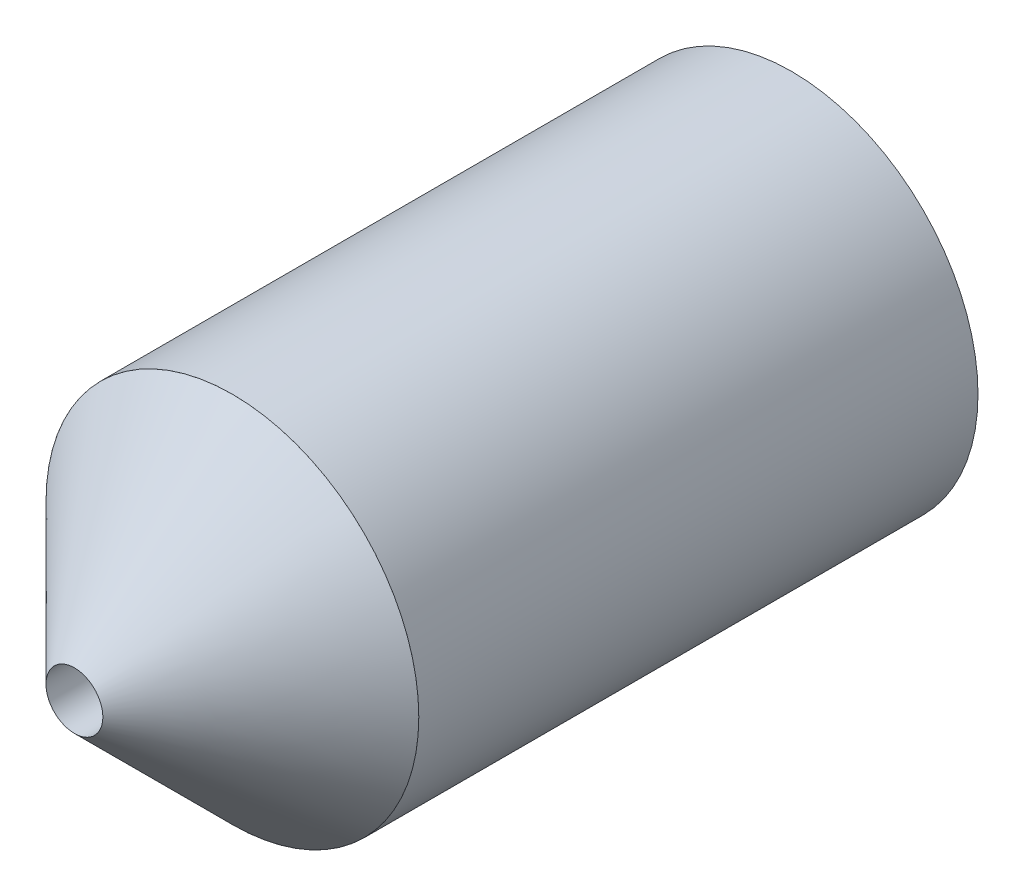
ISO-10303-21;
HEADER;
FILE_DESCRIPTION(('STEP AP214'),'2;1');
FILE_NAME('part.step','',(''),(''),'','','');
FILE_SCHEMA(('AUTOMOTIVE_DESIGN { 1 0 10303 214 1 1 1 1 }'));
ENDSEC;
DATA;
#1=APPLICATION_CONTEXT('core data for automotive mechanical design processes');
#2=APPLICATION_PROTOCOL_DEFINITION('international standard','automotive_design',2000,#1);
#3=PRODUCT_CONTEXT('',#1,'mechanical');
#4=PRODUCT('Part','Part','',(#3));
#5=PRODUCT_RELATED_PRODUCT_CATEGORY('part','',(#4));
#6=PRODUCT_DEFINITION_FORMATION('','',#4);
#7=PRODUCT_DEFINITION_CONTEXT('part definition',#1,'design');
#8=PRODUCT_DEFINITION('design','',#6,#7);
#9=PRODUCT_DEFINITION_SHAPE('','',#8);
#10=(LENGTH_UNIT() NAMED_UNIT(*) SI_UNIT(.MILLI.,.METRE.));
#11=(NAMED_UNIT(*) PLANE_ANGLE_UNIT() SI_UNIT($,.RADIAN.));
#12=(NAMED_UNIT(*) SI_UNIT($,.STERADIAN.) SOLID_ANGLE_UNIT());
#13=UNCERTAINTY_MEASURE_WITH_UNIT(LENGTH_MEASURE(1.E-05),#10,'distance_accuracy_value','');
#14=(GEOMETRIC_REPRESENTATION_CONTEXT(3) GLOBAL_UNCERTAINTY_ASSIGNED_CONTEXT((#13)) GLOBAL_UNIT_ASSIGNED_CONTEXT((#10,
#11,#12)) REPRESENTATION_CONTEXT('',''));
#15=CARTESIAN_POINT('',(0.,0.,0.));
#16=DIRECTION('',(0.,0.,1.));
#17=DIRECTION('',(1.,0.,0.));
#18=AXIS2_PLACEMENT_3D('',#15,#16,#17);
#19=CARTESIAN_POINT('',(0.,0.,60.));
#20=DIRECTION('',(0.,0.,-1.));
#21=DIRECTION('',(-1.,0.,0.));
#22=AXIS2_PLACEMENT_3D('',#19,#20,#21);
#23=CYLINDRICAL_SURFACE('',#22,20.);
#24=CARTESIAN_POINT('',(0.,0.,60.));
#25=DIRECTION('',(0.,0.,1.));
#26=DIRECTION('',(1.,0.,0.));
#27=AXIS2_PLACEMENT_3D('',#24,#25,#26);
#28=CIRCLE('',#27,20.);
#29=CARTESIAN_POINT('',(20.,0.,60.));
#30=VERTEX_POINT('',#29);
#31=EDGE_CURVE('E42',#30,#30,#28,.T.);
#32=ORIENTED_EDGE('',*,*,#31,.F.);
#33=EDGE_LOOP('',(#32));
#34=FACE_BOUND('',#33,.T.);
#35=CARTESIAN_POINT('',(0.,0.,0.));
#36=DIRECTION('',(0.,0.,1.));
#37=DIRECTION('',(1.,0.,0.));
#38=AXIS2_PLACEMENT_3D('',#35,#36,#37);
#39=CIRCLE('',#38,20.);
#40=CARTESIAN_POINT('',(20.,0.,0.));
#41=VERTEX_POINT('',#40);
#42=EDGE_CURVE('E46',#41,#41,#39,.T.);
#43=ORIENTED_EDGE('',*,*,#42,.T.);
#44=EDGE_LOOP('',(#43));
#45=FACE_BOUND('',#44,.T.);
#46=ADVANCED_FACE('F35',(#34,#45),#23,.T.);
#47=CARTESIAN_POINT('',(0.,0.,60.));
#48=DIRECTION('',(0.,0.,1.));
#49=DIRECTION('',(1.,0.,0.));
#50=AXIS2_PLACEMENT_3D('',#47,#48,#49);
#51=PLANE('',#50);
#52=CARTESIAN_POINT('',(0.,0.,60.));
#53=DIRECTION('',(0.,0.,1.));
#54=DIRECTION('',(1.,0.,0.));
#55=AXIS2_PLACEMENT_3D('',#52,#53,#54);
#56=CIRCLE('',#55,19.9980247122554);
#57=CARTESIAN_POINT('',(-19.9980247122554,0.,60.));
#58=VERTEX_POINT('',#57);
#59=EDGE_CURVE('E10',#58,#58,#56,.T.);
#60=ORIENTED_EDGE('',*,*,#59,.F.);
#61=EDGE_LOOP('',(#60));
#62=FACE_BOUND('',#61,.T.);
#63=ORIENTED_EDGE('',*,*,#31,.T.);
#64=EDGE_LOOP('',(#63));
#65=FACE_BOUND('',#64,.T.);
#66=ADVANCED_FACE('F75',(#62,#65),#51,.T.);
#67=CARTESIAN_POINT('',(0.,0.,0.));
#68=DIRECTION('',(0.,0.,1.));
#69=DIRECTION('',(1.,0.,0.));
#70=AXIS2_PLACEMENT_3D('',#67,#68,#69);
#71=PLANE('',#70);
#72=CARTESIAN_POINT('',(0.,0.,0.));
#73=DIRECTION('',(0.,0.,-1.));
#74=DIRECTION('',(-1.,0.,0.));
#75=AXIS2_PLACEMENT_3D('',#72,#73,#74);
#76=CIRCLE('',#75,3.29);
#77=CARTESIAN_POINT('',(-3.29,0.,0.));
#78=VERTEX_POINT('',#77);
#79=EDGE_CURVE('E55',#78,#78,#76,.T.);
#80=ORIENTED_EDGE('',*,*,#79,.F.);
#81=EDGE_LOOP('',(#80));
#82=FACE_BOUND('',#81,.T.);
#83=ORIENTED_EDGE('',*,*,#42,.F.);
#84=EDGE_LOOP('',(#83));
#85=FACE_BOUND('',#84,.T.);
#86=ADVANCED_FACE('F71',(#82,#85),#71,.F.);
#87=CARTESIAN_POINT('',(0.,0.,30.));
#88=DIRECTION('',(0.,0.,1.));
#89=DIRECTION('',(1.,0.,0.));
#90=AXIS2_PLACEMENT_3D('',#87,#88,#89);
#91=CYLINDRICAL_SURFACE('',#90,3.05);
#92=CARTESIAN_POINT('',(0.,0.,30.));
#93=DIRECTION('',(0.,0.,1.));
#94=DIRECTION('',(1.,0.,0.));
#95=AXIS2_PLACEMENT_3D('',#92,#93,#94);
#96=CIRCLE('',#95,3.05);
#97=CARTESIAN_POINT('',(3.05,0.,30.));
#98=VERTEX_POINT('',#97);
#99=EDGE_CURVE('E50',#98,#98,#96,.T.);
#100=ORIENTED_EDGE('',*,*,#99,.F.);
#101=EDGE_LOOP('',(#100));
#102=FACE_BOUND('',#101,.T.);
#103=CARTESIAN_POINT('',(0.,0.,76.9496987388651));
#104=DIRECTION('',(0.,0.,-1.));
#105=DIRECTION('',(-1.,0.,0.));
#106=AXIS2_PLACEMENT_3D('',#103,#104,#105);
#107=CIRCLE('',#106,3.05);
#108=CARTESIAN_POINT('',(-3.05,0.,76.9496987388651));
#109=VERTEX_POINT('',#108);
#110=EDGE_CURVE('E38',#109,#109,#107,.F.);
#111=ORIENTED_EDGE('',*,*,#110,.T.);
#112=EDGE_LOOP('',(#111));
#113=FACE_BOUND('',#112,.T.);
#114=ADVANCED_FACE('F74',(#102,#113),#91,.F.);
#115=CARTESIAN_POINT('',(0.,0.,30.));
#116=DIRECTION('',(0.,0.,-1.));
#117=DIRECTION('',(-1.,0.,0.));
#118=AXIS2_PLACEMENT_3D('',#115,#116,#117);
#119=PLANE('',#118);
#120=CARTESIAN_POINT('',(0.,0.,30.));
#121=DIRECTION('',(0.,0.,-1.));
#122=DIRECTION('',(-1.,0.,0.));
#123=AXIS2_PLACEMENT_3D('',#120,#121,#122);
#124=CIRCLE('',#123,3.29);
#125=CARTESIAN_POINT('',(-3.29,0.,30.));
#126=VERTEX_POINT('',#125);
#127=EDGE_CURVE('E54',#126,#126,#124,.T.);
#128=ORIENTED_EDGE('',*,*,#127,.T.);
#129=EDGE_LOOP('',(#128));
#130=FACE_BOUND('',#129,.T.);
#131=ORIENTED_EDGE('',*,*,#99,.T.);
#132=EDGE_LOOP('',(#131));
#133=FACE_BOUND('',#132,.T.);
#134=ADVANCED_FACE('F61',(#130,#133),#119,.T.);
#135=CARTESIAN_POINT('',(0.,0.,30.));
#136=DIRECTION('',(0.,0.,-1.));
#137=DIRECTION('',(-1.,0.,0.));
#138=AXIS2_PLACEMENT_3D('',#135,#136,#137);
#139=CYLINDRICAL_SURFACE('',#138,3.29);
#140=ORIENTED_EDGE('',*,*,#127,.F.);
#141=EDGE_LOOP('',(#140));
#142=FACE_BOUND('',#141,.T.);
#143=ORIENTED_EDGE('',*,*,#79,.T.);
#144=EDGE_LOOP('',(#143));
#145=FACE_BOUND('',#144,.T.);
#146=ADVANCED_FACE('F64',(#142,#145),#139,.F.);
#147=CARTESIAN_POINT('',(0.,0.,60.));
#148=DIRECTION('',(0.,0.,-1.));
#149=DIRECTION('',(-1.,0.,0.));
#150=AXIS2_PLACEMENT_3D('',#147,#148,#149);
#151=CONICAL_SURFACE('',#150,19.9980247122554,0.785348778765152);
#152=CARTESIAN_POINT('',(-3.05,0.,76.9496987388651));
#153=CARTESIAN_POINT('',(-3.22654192408599,0.,76.7731393770019));
#154=CARTESIAN_POINT('',(-3.40308384817199,0.,76.5965800151387));
#155=CARTESIAN_POINT('',(-3.75616769634397,0.,76.2434612914124));
#156=CARTESIAN_POINT('',(-3.93270962042997,0.,76.0669019295492));
#157=CARTESIAN_POINT('',(-4.28579346860195,0.,75.7137832058228));
#158=CARTESIAN_POINT('',(-4.46233539268795,0.,75.5372238439597));
#159=CARTESIAN_POINT('',(-4.81541924085994,0.,75.1841051202333));
#160=CARTESIAN_POINT('',(-4.99196116494593,0.,75.0075457583701));
#161=CARTESIAN_POINT('',(-5.34504501311792,0.,74.6544270346438));
#162=CARTESIAN_POINT('',(-5.52158693720392,0.,74.4778676727806));
#163=CARTESIAN_POINT('',(-5.8746707853759,0.,74.1247489490542));
#164=CARTESIAN_POINT('',(-6.0512127094619,0.,73.9481895871911));
#165=CARTESIAN_POINT('',(-6.40429655763388,0.,73.5950708634647));
#166=CARTESIAN_POINT('',(-6.58083848171988,0.,73.4185115016015));
#167=CARTESIAN_POINT('',(-6.93392232989187,0.,73.0653927778752));
#168=CARTESIAN_POINT('',(-7.11046425397786,0.,72.888833416012));
#169=CARTESIAN_POINT('',(-7.46354810214985,0.,72.5357146922856));
#170=CARTESIAN_POINT('',(-7.64009002623584,0.,72.3591553304225));
#171=CARTESIAN_POINT('',(-7.99317387440783,0.,72.0060366066961));
#172=CARTESIAN_POINT('',(-8.16971579849382,0.,71.8294772448329));
#173=CARTESIAN_POINT('',(-8.52279964666581,0.,71.4763585211066));
#174=CARTESIAN_POINT('',(-8.69934157075181,0.,71.2997991592434));
#175=CARTESIAN_POINT('',(-9.0524254189238,0.,70.946680435517));
#176=CARTESIAN_POINT('',(-9.22896734300979,0.,70.7701210736539));
#177=CARTESIAN_POINT('',(-9.58205119118178,0.,70.4170023499275));
#178=CARTESIAN_POINT('',(-9.75859311526777,0.,70.2404429880643));
#179=CARTESIAN_POINT('',(-10.1116769634398,0.,69.887324264338));
#180=CARTESIAN_POINT('',(-10.2882188875258,0.,69.7107649024748));
#181=CARTESIAN_POINT('',(-10.6413027356977,0.,69.3576461787484));
#182=CARTESIAN_POINT('',(-10.8178446597837,0.,69.1810868168853));
#183=CARTESIAN_POINT('',(-11.1709285079557,0.,68.8279680931589));
#184=CARTESIAN_POINT('',(-11.3474704320417,0.,68.6514087312957));
#185=CARTESIAN_POINT('',(-11.7005542802137,0.,68.2982900075694));
#186=CARTESIAN_POINT('',(-11.8770962042997,0.,68.1217306457062));
#187=CARTESIAN_POINT('',(-12.2301800524717,0.,67.7686119219798));
#188=CARTESIAN_POINT('',(-12.4067219765577,0.,67.5920525601166));
#189=CARTESIAN_POINT('',(-12.7598058247297,0.,67.2389338363903));
#190=CARTESIAN_POINT('',(-12.9363477488157,0.,67.0623744745271));
#191=CARTESIAN_POINT('',(-13.2894315969876,0.,66.7092557508008));
#192=CARTESIAN_POINT('',(-13.4659735210736,0.,66.5326963889376));
#193=CARTESIAN_POINT('',(-13.8190573692456,0.,66.1795776652112));
#194=CARTESIAN_POINT('',(-13.9955992933316,0.,66.0030183033481));
#195=CARTESIAN_POINT('',(-14.3486831415036,0.,65.6498995796217));
#196=CARTESIAN_POINT('',(-14.5252250655896,0.,65.4733402177585));
#197=CARTESIAN_POINT('',(-14.8783089137616,0.,65.1202214940322));
#198=CARTESIAN_POINT('',(-15.0548508378476,0.,64.943662132169));
#199=CARTESIAN_POINT('',(-15.4079346860196,0.,64.5905434084426));
#200=CARTESIAN_POINT('',(-15.5844766101056,0.,64.4139840465794));
#201=CARTESIAN_POINT('',(-15.9375604582776,0.,64.0608653228531));
#202=CARTESIAN_POINT('',(-16.1141023823636,0.,63.8843059609899));
#203=CARTESIAN_POINT('',(-16.4671862305355,0.,63.5311872372636));
#204=CARTESIAN_POINT('',(-16.6437281546215,0.,63.3546278754004));
#205=CARTESIAN_POINT('',(-16.9968120027935,0.,63.001509151674));
#206=CARTESIAN_POINT('',(-17.1733539268795,0.,62.8249497898108));
#207=CARTESIAN_POINT('',(-17.5264377750515,0.,62.4718310660845));
#208=CARTESIAN_POINT('',(-17.7029796991375,0.,62.2952717042213));
#209=CARTESIAN_POINT('',(-18.0560635473095,0.,61.942152980495));
#210=CARTESIAN_POINT('',(-18.2326054713955,0.,61.7655936186318));
#211=CARTESIAN_POINT('',(-18.5856893195675,0.,61.4124748949054));
#212=CARTESIAN_POINT('',(-18.7622312436535,0.,61.2359155330422));
#213=CARTESIAN_POINT('',(-19.1153150918255,0.,60.8827968093159));
#214=CARTESIAN_POINT('',(-19.2918570159114,0.,60.7062374474527));
#215=CARTESIAN_POINT('',(-19.6449408640834,0.,60.3531187237263));
#216=CARTESIAN_POINT('',(-19.8214827881694,0.,60.1765593618632));
#217=CARTESIAN_POINT('',(-19.9980247122554,0.,60.));
#218=B_SPLINE_CURVE_WITH_KNOTS('',3,(#152,#153,#154,#155,#156,#157,#158,#159,#160,#161,#162,
#163,#164,#165,#166,#167,#168,#169,#170,#171,#172,#173,#174,#175,#176,#177,#178,#179,#180,#181,
#182,#183,#184,#185,#186,#187,#188,#189,#190,#191,#192,#193,#194,#195,#196,#197,#198,#199,#200,
#201,#202,#203,#204,#205,#206,#207,#208,#209,#210,#211,#212,#213,#214,#215,#216,#217),
.UNSPECIFIED.,.F.,.F.,(4,2,2,2,2,2,2,2,2,2,2,2,2,2,2,2,2,2,2,2,2,2,2,2,2,2,2,2,2,2,2,2,4),(0.,
0.74904094213445,1.4980818842689,2.24712282640334,2.99616376853778,3.74520471067223,
4.49424565280668,5.24328659494113,5.99232753707557,6.74136847921002,7.49040942134447,
8.23945036347891,8.98849130561335,9.7375322477478,10.4865731898822,11.2356141320167,
11.9846550741511,12.7336960162856,13.48273695842,14.2317779005545,14.9808188426889,
15.7298597848234,16.4789007269578,17.2279416690922,17.9769826112267,18.7260235533611,
19.4750644954956,20.22410543763,20.9731463797645,21.7221873218989,22.4712282640334,
23.2202692061678,23.9693101483022),.UNSPECIFIED.);
#219=EDGE_CURVE('BSEAM67',#109,#58,#218,.T.);
#220=ORIENTED_EDGE('',*,*,#110,.F.);
#221=ORIENTED_EDGE('',*,*,#59,.T.);
#222=ORIENTED_EDGE('',*,*,#219,.T.);
#223=ORIENTED_EDGE('',*,*,#219,.F.);
#224=EDGE_LOOP('',(#220,#222,#221,#223));
#225=FACE_BOUND('',#224,.T.);
#226=ADVANCED_FACE('F67',(#225),#151,.T.);
#227=CLOSED_SHELL('',(#46,#66,#86,#114,#134,#146,#226));
#228=MANIFOLD_SOLID_BREP('B2',#227);
#229=ADVANCED_BREP_SHAPE_REPRESENTATION('',(#18,#228),#14);
#230=SHAPE_DEFINITION_REPRESENTATION(#9,#229);
ENDSEC;
END-ISO-10303-21;
